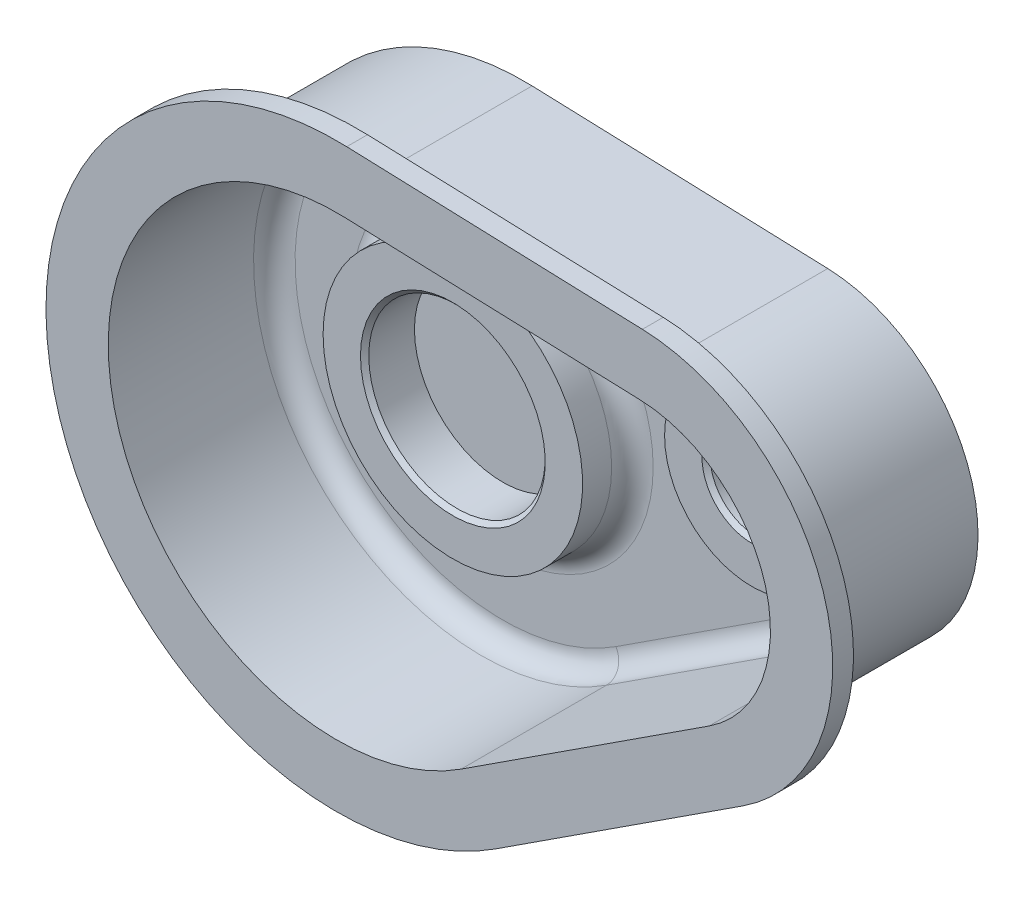
ISO-10303-21;
HEADER;
FILE_DESCRIPTION(('STEP AP214'),'2;1');
FILE_NAME('part.step','',(''),(''),'','','');
FILE_SCHEMA(('AUTOMOTIVE_DESIGN { 1 0 10303 214 1 1 1 1 }'));
ENDSEC;
DATA;
#1=APPLICATION_CONTEXT('core data for automotive mechanical design processes');
#2=APPLICATION_PROTOCOL_DEFINITION('international standard','automotive_design',2000,#1);
#3=PRODUCT_CONTEXT('',#1,'mechanical');
#4=PRODUCT('Part','Part','',(#3));
#5=PRODUCT_RELATED_PRODUCT_CATEGORY('part','',(#4));
#6=PRODUCT_DEFINITION_FORMATION('','',#4);
#7=PRODUCT_DEFINITION_CONTEXT('part definition',#1,'design');
#8=PRODUCT_DEFINITION('design','',#6,#7);
#9=PRODUCT_DEFINITION_SHAPE('','',#8);
#10=(LENGTH_UNIT() NAMED_UNIT(*) SI_UNIT(.MILLI.,.METRE.));
#11=(NAMED_UNIT(*) PLANE_ANGLE_UNIT() SI_UNIT($,.RADIAN.));
#12=(NAMED_UNIT(*) SI_UNIT($,.STERADIAN.) SOLID_ANGLE_UNIT());
#13=UNCERTAINTY_MEASURE_WITH_UNIT(LENGTH_MEASURE(1.E-05),#10,'distance_accuracy_value','');
#14=(GEOMETRIC_REPRESENTATION_CONTEXT(3) GLOBAL_UNCERTAINTY_ASSIGNED_CONTEXT((#13)) GLOBAL_UNIT_ASSIGNED_CONTEXT((#10,
#11,#12)) REPRESENTATION_CONTEXT('',''));
#15=CARTESIAN_POINT('',(0.,0.,0.));
#16=DIRECTION('',(0.,0.,1.));
#17=DIRECTION('',(1.,0.,0.));
#18=AXIS2_PLACEMENT_3D('',#15,#16,#17);
#19=CARTESIAN_POINT('',(0.,0.,45.));
#20=DIRECTION('',(0.,0.,1.));
#21=DIRECTION('',(1.,0.,0.));
#22=AXIS2_PLACEMENT_3D('',#19,#20,#21);
#23=PLANE('',#22);
#24=CARTESIAN_POINT('',(0.,0.,45.));
#25=DIRECTION('',(0.,0.,1.));
#26=DIRECTION('',(1.,0.,0.));
#27=AXIS2_PLACEMENT_3D('',#24,#25,#26);
#28=CIRCLE('',#27,55.);
#29=CARTESIAN_POINT('',(1.9190246900668,54.9665111157596,45.));
#30=VERTEX_POINT('',#29);
#31=CARTESIAN_POINT('',(29.9935827597899,-46.1018979352437,45.));
#32=VERTEX_POINT('',#31);
#33=EDGE_CURVE('E201',#30,#32,#28,.T.);
#34=ORIENTED_EDGE('',*,*,#33,.F.);
#35=DIRECTION('',(-0.999391111195628,0.0348913580012145,0.));
#36=VECTOR('',#35,1.);
#37=CARTESIAN_POINT('',(1.9190246900668,54.9665111157596,45.));
#38=LINE('',#37,#36);
#39=CARTESIAN_POINT('',(73.1339691350395,52.4802111138579,45.));
#40=VERTEX_POINT('',#39);
#41=EDGE_CURVE('E218',#40,#30,#38,.T.);
#42=ORIENTED_EDGE('',*,*,#41,.F.);
#43=CARTESIAN_POINT('',(72.,20.,45.));
#44=DIRECTION('',(0.,0.,1.));
#45=DIRECTION('',(1.,0.,0.));
#46=AXIS2_PLACEMENT_3D('',#43,#44,#45);
#47=CIRCLE('',#46,32.5);
#48=CARTESIAN_POINT('',(89.723480721694,-7.24203059809859,45.));
#49=VERTEX_POINT('',#48);
#50=EDGE_CURVE('E221',#49,#40,#47,.T.);
#51=ORIENTED_EDGE('',*,*,#50,.F.);
#52=DIRECTION('',(0.838216326095341,0.545337868359817,0.));
#53=VECTOR('',#52,1.);
#54=CARTESIAN_POINT('',(89.723480721694,-7.24203059809858,45.));
#55=LINE('',#54,#53);
#56=EDGE_CURVE('E224',#32,#49,#55,.T.);
#57=ORIENTED_EDGE('',*,*,#56,.F.);
#58=EDGE_LOOP('',(#34,#42,#51,#57));
#59=FACE_BOUND('',#58,.T.);
#60=CARTESIAN_POINT('',(72.,20.,45.));
#61=DIRECTION('',(0.,0.,1.));
#62=DIRECTION('',(1.,0.,0.));
#63=AXIS2_PLACEMENT_3D('',#60,#61,#62);
#64=CIRCLE('',#63,47.5);
#65=CARTESIAN_POINT('',(97.9035487470913,-19.8152754895287,45.));
#66=VERTEX_POINT('',#65);
#67=CARTESIAN_POINT('',(73.6573395050577,67.4710777817923,45.));
#68=VERTEX_POINT('',#67);
#69=EDGE_CURVE('E173',#66,#68,#64,.T.);
#70=ORIENTED_EDGE('',*,*,#69,.T.);
#71=DIRECTION('',(-0.999391111195628,0.0348913580012143,0.));
#72=VECTOR('',#71,1.);
#73=CARTESIAN_POINT('',(73.6573395050577,67.4710777817923,45.));
#74=LINE('',#73,#72);
#75=CARTESIAN_POINT('',(2.44239506008501,69.9573777836939,45.));
#76=VERTEX_POINT('',#75);
#77=EDGE_CURVE('E176',#68,#76,#74,.T.);
#78=ORIENTED_EDGE('',*,*,#77,.T.);
#79=CARTESIAN_POINT('',(0.,0.,45.));
#80=DIRECTION('',(0.,0.,1.));
#81=DIRECTION('',(1.,0.,0.));
#82=AXIS2_PLACEMENT_3D('',#79,#80,#81);
#83=CIRCLE('',#82,70.);
#84=CARTESIAN_POINT('',(38.1736507851872,-58.6751428266739,45.));
#85=VERTEX_POINT('',#84);
#86=EDGE_CURVE('E200',#76,#85,#83,.T.);
#87=ORIENTED_EDGE('',*,*,#86,.T.);
#88=DIRECTION('',(0.838216326095341,0.545337868359817,0.));
#89=VECTOR('',#88,1.);
#90=CARTESIAN_POINT('',(38.1736507851872,-58.6751428266739,45.));
#91=LINE('',#90,#89);
#92=EDGE_CURVE('E184',#85,#66,#91,.T.);
#93=ORIENTED_EDGE('',*,*,#92,.T.);
#94=EDGE_LOOP('',(#70,#78,#87,#93));
#95=FACE_BOUND('',#94,.T.);
#96=ADVANCED_FACE('F43',(#59,#95),#23,.T.);
#97=CARTESIAN_POINT('',(0.,0.,45.));
#98=DIRECTION('',(0.,0.,-1.));
#99=DIRECTION('',(-1.,0.,0.));
#100=AXIS2_PLACEMENT_3D('',#97,#98,#99);
#101=CYLINDRICAL_SURFACE('',#100,55.);
#102=DIRECTION('',(0.,0.,1.));
#103=VECTOR('',#102,1.);
#104=CARTESIAN_POINT('',(29.9935827597899,-46.1018979352437,45.));
#105=LINE('',#104,#103);
#106=CARTESIAN_POINT('',(29.9935827597899,-46.1018979352437,10.));
#107=VERTEX_POINT('',#106);
#108=EDGE_CURVE('E208',#32,#107,#105,.F.);
#109=ORIENTED_EDGE('',*,*,#108,.T.);
#110=CARTESIAN_POINT('',(0.,0.,10.));
#111=DIRECTION('',(0.,0.,1.));
#112=DIRECTION('',(1.,0.,0.));
#113=AXIS2_PLACEMENT_3D('',#110,#111,#112);
#114=CIRCLE('',#113,55.);
#115=CARTESIAN_POINT('',(1.9190246900668,54.9665111157595,10.));
#116=VERTEX_POINT('',#115);
#117=EDGE_CURVE('E253',#107,#116,#114,.F.);
#118=ORIENTED_EDGE('',*,*,#117,.T.);
#119=DIRECTION('',(0.,0.,-1.));
#120=VECTOR('',#119,1.);
#121=CARTESIAN_POINT('',(1.9190246900668,54.9665111157595,45.));
#122=LINE('',#121,#120);
#123=EDGE_CURVE('E214',#30,#116,#122,.T.);
#124=ORIENTED_EDGE('',*,*,#123,.F.);
#125=ORIENTED_EDGE('',*,*,#33,.T.);
#126=EDGE_LOOP('',(#109,#118,#124,#125));
#127=FACE_BOUND('',#126,.T.);
#128=ADVANCED_FACE('F300',(#127),#101,.F.);
#129=CARTESIAN_POINT('',(89.723480721694,-7.24203059809858,45.));
#130=DIRECTION('',(-0.545337868359817,0.838216326095341,0.));
#131=DIRECTION('',(-0.838216326095341,-0.545337868359817,0.));
#132=AXIS2_PLACEMENT_3D('',#129,#130,#131);
#133=PLANE('',#132);
#134=DIRECTION('',(0.,0.,-1.));
#135=VECTOR('',#134,1.);
#136=CARTESIAN_POINT('',(89.7234807216941,-7.2420305980986,45.));
#137=LINE('',#136,#135);
#138=CARTESIAN_POINT('',(89.7234807216941,-7.2420305980986,10.));
#139=VERTEX_POINT('',#138);
#140=EDGE_CURVE('E213',#49,#139,#137,.T.);
#141=ORIENTED_EDGE('',*,*,#140,.T.);
#142=DIRECTION('',(0.838216326095341,0.545337868359817,0.));
#143=VECTOR('',#142,1.);
#144=CARTESIAN_POINT('',(29.9935827597899,-46.1018979352438,10.));
#145=LINE('',#144,#143);
#146=EDGE_CURVE('E263',#139,#107,#145,.F.);
#147=ORIENTED_EDGE('',*,*,#146,.T.);
#148=ORIENTED_EDGE('',*,*,#108,.F.);
#149=ORIENTED_EDGE('',*,*,#56,.T.);
#150=EDGE_LOOP('',(#141,#147,#148,#149));
#151=FACE_BOUND('',#150,.T.);
#152=ADVANCED_FACE('F304',(#151),#133,.T.);
#153=CARTESIAN_POINT('',(72.,20.,45.));
#154=DIRECTION('',(0.,0.,-1.));
#155=DIRECTION('',(-1.,0.,0.));
#156=AXIS2_PLACEMENT_3D('',#153,#154,#155);
#157=CYLINDRICAL_SURFACE('',#156,32.5);
#158=DIRECTION('',(0.,0.,1.));
#159=VECTOR('',#158,1.);
#160=CARTESIAN_POINT('',(73.1339691350395,52.4802111138579,45.));
#161=LINE('',#160,#159);
#162=CARTESIAN_POINT('',(73.1339691350395,52.4802111138579,10.));
#163=VERTEX_POINT('',#162);
#164=EDGE_CURVE('E220',#40,#163,#161,.F.);
#165=ORIENTED_EDGE('',*,*,#164,.T.);
#166=CARTESIAN_POINT('',(72.,20.,10.));
#167=DIRECTION('',(0.,0.,1.));
#168=DIRECTION('',(1.,0.,0.));
#169=AXIS2_PLACEMENT_3D('',#166,#167,#168);
#170=CIRCLE('',#169,32.5);
#171=EDGE_CURVE('E56',#163,#139,#170,.F.);
#172=ORIENTED_EDGE('',*,*,#171,.T.);
#173=ORIENTED_EDGE('',*,*,#140,.F.);
#174=ORIENTED_EDGE('',*,*,#50,.T.);
#175=EDGE_LOOP('',(#165,#172,#173,#174));
#176=FACE_BOUND('',#175,.T.);
#177=ADVANCED_FACE('F404',(#176),#157,.F.);
#178=CARTESIAN_POINT('',(1.9190246900668,54.9665111157596,45.));
#179=DIRECTION('',(-0.0348913580012145,-0.999391111195627,0.));
#180=DIRECTION('',(0.999391111195628,-0.0348913580012145,0.));
#181=AXIS2_PLACEMENT_3D('',#178,#179,#180);
#182=PLANE('',#181);
#183=ORIENTED_EDGE('',*,*,#123,.T.);
#184=DIRECTION('',(-0.999391111195628,0.0348913580012145,0.));
#185=VECTOR('',#184,1.);
#186=CARTESIAN_POINT('',(73.1339691350395,52.4802111138579,10.));
#187=LINE('',#186,#185);
#188=EDGE_CURVE('E70',#116,#163,#187,.F.);
#189=ORIENTED_EDGE('',*,*,#188,.T.);
#190=ORIENTED_EDGE('',*,*,#164,.F.);
#191=ORIENTED_EDGE('',*,*,#41,.T.);
#192=EDGE_LOOP('',(#183,#189,#190,#191));
#193=FACE_BOUND('',#192,.T.);
#194=ADVANCED_FACE('F397',(#193),#182,.T.);
#195=CARTESIAN_POINT('',(0.,0.,5.));
#196=DIRECTION('',(0.,0.,1.));
#197=DIRECTION('',(1.,0.,0.));
#198=AXIS2_PLACEMENT_3D('',#195,#196,#197);
#199=PLANE('',#198);
#200=CARTESIAN_POINT('',(0.,0.,5.));
#201=DIRECTION('',(0.,0.,1.));
#202=DIRECTION('',(1.,0.,0.));
#203=AXIS2_PLACEMENT_3D('',#200,#201,#202);
#204=CIRCLE('',#203,36.25);
#205=CARTESIAN_POINT('',(36.25,0.,5.));
#206=VERTEX_POINT('',#205);
#207=EDGE_CURVE('E255',#206,#206,#204,.F.);
#208=ORIENTED_EDGE('',*,*,#207,.T.);
#209=EDGE_LOOP('',(#208));
#210=FACE_BOUND('',#209,.T.);
#211=DIRECTION('',(-0.999391111195628,0.0348913580012145,0.));
#212=VECTOR('',#211,1.);
#213=CARTESIAN_POINT('',(1.74456790006073,49.9695555597814,5.));
#214=LINE('',#213,#212);
#215=CARTESIAN_POINT('',(72.9595123450334,47.4832555578798,5.));
#216=VERTEX_POINT('',#215);
#217=CARTESIAN_POINT('',(1.74456790006073,49.9695555597814,5.));
#218=VERTEX_POINT('',#217);
#219=EDGE_CURVE('E250',#216,#218,#214,.T.);
#220=ORIENTED_EDGE('',*,*,#219,.T.);
#221=CARTESIAN_POINT('',(0.,0.,5.));
#222=DIRECTION('',(0.,0.,1.));
#223=DIRECTION('',(1.,0.,0.));
#224=AXIS2_PLACEMENT_3D('',#221,#222,#223);
#225=CIRCLE('',#224,50.);
#226=CARTESIAN_POINT('',(27.2668934179909,-41.9108163047671,5.));
#227=VERTEX_POINT('',#226);
#228=EDGE_CURVE('E248',#218,#227,#225,.T.);
#229=ORIENTED_EDGE('',*,*,#228,.T.);
#230=DIRECTION('',(0.838216326095341,0.545337868359817,0.));
#231=VECTOR('',#230,1.);
#232=CARTESIAN_POINT('',(86.996791379895,-3.05094896762188,5.));
#233=LINE('',#232,#231);
#234=CARTESIAN_POINT('',(86.996791379895,-3.05094896762188,5.));
#235=VERTEX_POINT('',#234);
#236=EDGE_CURVE('E243',#227,#235,#233,.T.);
#237=ORIENTED_EDGE('',*,*,#236,.T.);
#238=CARTESIAN_POINT('',(72.,20.,5.));
#239=DIRECTION('',(0.,0.,1.));
#240=DIRECTION('',(1.,0.,0.));
#241=AXIS2_PLACEMENT_3D('',#238,#239,#240);
#242=CIRCLE('',#241,27.5);
#243=EDGE_CURVE('E244',#235,#216,#242,.T.);
#244=ORIENTED_EDGE('',*,*,#243,.T.);
#245=EDGE_LOOP('',(#220,#229,#237,#244));
#246=FACE_BOUND('',#245,.T.);
#247=CARTESIAN_POINT('',(72.,20.,5.));
#248=DIRECTION('',(0.,0.,1.));
#249=DIRECTION('',(1.,0.,0.));
#250=AXIS2_PLACEMENT_3D('',#247,#248,#249);
#251=CIRCLE('',#250,21.);
#252=CARTESIAN_POINT('',(93.,20.,5.));
#253=VERTEX_POINT('',#252);
#254=EDGE_CURVE('E239',#253,#253,#251,.T.);
#255=ORIENTED_EDGE('',*,*,#254,.F.);
#256=EDGE_LOOP('',(#255));
#257=FACE_BOUND('',#256,.T.);
#258=ADVANCED_FACE('F315',(#210,#246,#257),#199,.T.);
#259=CARTESIAN_POINT('',(72.,20.,40.));
#260=DIRECTION('',(0.,0.,1.));
#261=DIRECTION('',(1.,0.,0.));
#262=AXIS2_PLACEMENT_3D('',#259,#260,#261);
#263=CYLINDRICAL_SURFACE('',#262,47.5);
#264=ORIENTED_EDGE('',*,*,#69,.F.);
#265=DIRECTION('',(0.,0.,1.));
#266=VECTOR('',#265,1.);
#267=CARTESIAN_POINT('',(97.9035487470913,-19.8152754895287,40.));
#268=LINE('',#267,#266);
#269=CARTESIAN_POINT('',(97.9035487470913,-19.8152754895287,40.));
#270=VERTEX_POINT('',#269);
#271=EDGE_CURVE('E204',#270,#66,#268,.T.);
#272=ORIENTED_EDGE('',*,*,#271,.F.);
#273=CARTESIAN_POINT('',(72.,20.,40.));
#274=DIRECTION('',(0.,0.,1.));
#275=DIRECTION('',(1.,0.,0.));
#276=AXIS2_PLACEMENT_3D('',#273,#274,#275);
#277=CIRCLE('',#276,47.5);
#278=CARTESIAN_POINT('',(73.6573395050577,67.4710777817923,40.));
#279=VERTEX_POINT('',#278);
#280=EDGE_CURVE('E181',#270,#279,#277,.T.);
#281=ORIENTED_EDGE('',*,*,#280,.T.);
#282=DIRECTION('',(0.,0.,1.));
#283=VECTOR('',#282,1.);
#284=CARTESIAN_POINT('',(73.6573395050577,67.4710777817923,40.));
#285=LINE('',#284,#283);
#286=EDGE_CURVE('E192',#279,#68,#285,.T.);
#287=ORIENTED_EDGE('',*,*,#286,.T.);
#288=EDGE_LOOP('',(#264,#272,#281,#287));
#289=FACE_BOUND('',#288,.T.);
#290=ADVANCED_FACE('F391',(#289),#263,.T.);
#291=CARTESIAN_POINT('',(38.1736507851872,-58.6751428266739,40.));
#292=DIRECTION('',(0.545337868359817,-0.838216326095341,0.));
#293=DIRECTION('',(0.838216326095341,0.545337868359817,0.));
#294=AXIS2_PLACEMENT_3D('',#291,#292,#293);
#295=PLANE('',#294);
#296=ORIENTED_EDGE('',*,*,#92,.F.);
#297=DIRECTION('',(0.,0.,1.));
#298=VECTOR('',#297,1.);
#299=CARTESIAN_POINT('',(38.1736507851872,-58.6751428266739,40.));
#300=LINE('',#299,#298);
#301=CARTESIAN_POINT('',(38.1736507851872,-58.6751428266739,40.));
#302=VERTEX_POINT('',#301);
#303=EDGE_CURVE('E203',#302,#85,#300,.T.);
#304=ORIENTED_EDGE('',*,*,#303,.F.);
#305=DIRECTION('',(0.838216326095341,0.545337868359817,0.));
#306=VECTOR('',#305,1.);
#307=CARTESIAN_POINT('',(38.1736507851872,-58.6751428266739,40.));
#308=LINE('',#307,#306);
#309=EDGE_CURVE('E191',#302,#270,#308,.T.);
#310=ORIENTED_EDGE('',*,*,#309,.T.);
#311=ORIENTED_EDGE('',*,*,#271,.T.);
#312=EDGE_LOOP('',(#296,#304,#310,#311));
#313=FACE_BOUND('',#312,.T.);
#314=ADVANCED_FACE('F402',(#313),#295,.T.);
#315=CARTESIAN_POINT('',(0.,0.,40.));
#316=DIRECTION('',(0.,0.,1.));
#317=DIRECTION('',(1.,0.,0.));
#318=AXIS2_PLACEMENT_3D('',#315,#316,#317);
#319=CYLINDRICAL_SURFACE('',#318,70.);
#320=ORIENTED_EDGE('',*,*,#86,.F.);
#321=DIRECTION('',(0.,0.,1.));
#322=VECTOR('',#321,1.);
#323=CARTESIAN_POINT('',(2.44239506008501,69.9573777836939,40.));
#324=LINE('',#323,#322);
#325=CARTESIAN_POINT('',(2.44239506008501,69.9573777836939,40.));
#326=VERTEX_POINT('',#325);
#327=EDGE_CURVE('E210',#326,#76,#324,.T.);
#328=ORIENTED_EDGE('',*,*,#327,.F.);
#329=CARTESIAN_POINT('',(0.,0.,40.));
#330=DIRECTION('',(0.,0.,1.));
#331=DIRECTION('',(1.,0.,0.));
#332=AXIS2_PLACEMENT_3D('',#329,#330,#331);
#333=CIRCLE('',#332,70.);
#334=EDGE_CURVE('E189',#326,#302,#333,.T.);
#335=ORIENTED_EDGE('',*,*,#334,.T.);
#336=ORIENTED_EDGE('',*,*,#303,.T.);
#337=EDGE_LOOP('',(#320,#328,#335,#336));
#338=FACE_BOUND('',#337,.T.);
#339=ADVANCED_FACE('F426',(#338),#319,.T.);
#340=CARTESIAN_POINT('',(73.6573395050577,67.4710777817923,40.));
#341=DIRECTION('',(0.0348913580012143,0.999391111195628,0.));
#342=DIRECTION('',(-0.999391111195628,0.0348913580012143,0.));
#343=AXIS2_PLACEMENT_3D('',#340,#341,#342);
#344=PLANE('',#343);
#345=ORIENTED_EDGE('',*,*,#77,.F.);
#346=ORIENTED_EDGE('',*,*,#286,.F.);
#347=DIRECTION('',(-0.999391111195628,0.0348913580012143,0.));
#348=VECTOR('',#347,1.);
#349=CARTESIAN_POINT('',(73.6573395050577,67.4710777817923,40.));
#350=LINE('',#349,#348);
#351=EDGE_CURVE('E183',#279,#326,#350,.T.);
#352=ORIENTED_EDGE('',*,*,#351,.T.);
#353=ORIENTED_EDGE('',*,*,#327,.T.);
#354=EDGE_LOOP('',(#345,#346,#352,#353));
#355=FACE_BOUND('',#354,.T.);
#356=ADVANCED_FACE('F424',(#355),#344,.T.);
#357=CARTESIAN_POINT('',(72.,20.,40.));
#358=DIRECTION('',(0.,0.,1.));
#359=DIRECTION('',(1.,0.,0.));
#360=AXIS2_PLACEMENT_3D('',#357,#358,#359);
#361=PLANE('',#360);
#362=DIRECTION('',(-0.999391111195628,0.0348913580012143,0.));
#363=VECTOR('',#362,1.);
#364=CARTESIAN_POINT('',(73.3084259250455,57.4771666698361,40.));
#365=LINE('',#364,#363);
#366=CARTESIAN_POINT('',(73.3084259250455,57.4771666698361,40.));
#367=VERTEX_POINT('',#366);
#368=CARTESIAN_POINT('',(2.09348148007288,59.9634666717377,40.));
#369=VERTEX_POINT('',#368);
#370=EDGE_CURVE('E149',#367,#369,#365,.T.);
#371=ORIENTED_EDGE('',*,*,#370,.T.);
#372=CARTESIAN_POINT('',(0.,0.,40.));
#373=DIRECTION('',(0.,0.,1.));
#374=DIRECTION('',(1.,0.,0.));
#375=AXIS2_PLACEMENT_3D('',#372,#373,#374);
#376=CIRCLE('',#375,60.);
#377=CARTESIAN_POINT('',(32.720272101589,-50.2929795657205,40.));
#378=VERTEX_POINT('',#377);
#379=EDGE_CURVE('E163',#369,#378,#376,.T.);
#380=ORIENTED_EDGE('',*,*,#379,.T.);
#381=DIRECTION('',(0.838216326095341,0.545337868359817,0.));
#382=VECTOR('',#381,1.);
#383=CARTESIAN_POINT('',(32.720272101589,-50.2929795657205,40.));
#384=LINE('',#383,#382);
#385=CARTESIAN_POINT('',(92.4501700634931,-11.4331122285753,40.));
#386=VERTEX_POINT('',#385);
#387=EDGE_CURVE('E168',#378,#386,#384,.T.);
#388=ORIENTED_EDGE('',*,*,#387,.T.);
#389=CARTESIAN_POINT('',(72.,20.,40.));
#390=DIRECTION('',(0.,0.,1.));
#391=DIRECTION('',(1.,0.,0.));
#392=AXIS2_PLACEMENT_3D('',#389,#390,#391);
#393=CIRCLE('',#392,37.5);
#394=EDGE_CURVE('E175',#386,#367,#393,.T.);
#395=ORIENTED_EDGE('',*,*,#394,.T.);
#396=EDGE_LOOP('',(#371,#380,#388,#395));
#397=FACE_BOUND('',#396,.T.);
#398=ORIENTED_EDGE('',*,*,#280,.F.);
#399=ORIENTED_EDGE('',*,*,#309,.F.);
#400=ORIENTED_EDGE('',*,*,#334,.F.);
#401=ORIENTED_EDGE('',*,*,#351,.F.);
#402=EDGE_LOOP('',(#398,#399,#400,#401));
#403=FACE_BOUND('',#402,.T.);
#404=ADVANCED_FACE('F167',(#397,#403),#361,.F.);
#405=CARTESIAN_POINT('',(0.,0.,0.));
#406=DIRECTION('',(0.,0.,1.));
#407=DIRECTION('',(1.,0.,0.));
#408=AXIS2_PLACEMENT_3D('',#405,#406,#407);
#409=PLANE('',#408);
#410=CARTESIAN_POINT('',(0.,0.,0.));
#411=DIRECTION('',(0.,0.,1.));
#412=DIRECTION('',(1.,0.,0.));
#413=AXIS2_PLACEMENT_3D('',#410,#411,#412);
#414=CIRCLE('',#413,60.);
#415=CARTESIAN_POINT('',(2.09348148007288,59.9634666717377,0.));
#416=VERTEX_POINT('',#415);
#417=CARTESIAN_POINT('',(32.720272101589,-50.2929795657205,0.));
#418=VERTEX_POINT('',#417);
#419=EDGE_CURVE('E212',#416,#418,#414,.T.);
#420=ORIENTED_EDGE('',*,*,#419,.F.);
#421=DIRECTION('',(-0.999391111195628,0.0348913580012145,0.));
#422=VECTOR('',#421,1.);
#423=CARTESIAN_POINT('',(2.09348148007288,59.9634666717377,0.));
#424=LINE('',#423,#422);
#425=CARTESIAN_POINT('',(73.3084259250455,57.4771666698361,0.));
#426=VERTEX_POINT('',#425);
#427=EDGE_CURVE('E153',#426,#416,#424,.T.);
#428=ORIENTED_EDGE('',*,*,#427,.F.);
#429=CARTESIAN_POINT('',(72.,20.,0.));
#430=DIRECTION('',(0.,0.,1.));
#431=DIRECTION('',(1.,0.,0.));
#432=AXIS2_PLACEMENT_3D('',#429,#430,#431);
#433=CIRCLE('',#432,37.5);
#434=CARTESIAN_POINT('',(92.4501700634931,-11.4331122285753,0.));
#435=VERTEX_POINT('',#434);
#436=EDGE_CURVE('E235',#435,#426,#433,.T.);
#437=ORIENTED_EDGE('',*,*,#436,.F.);
#438=DIRECTION('',(0.838216326095341,0.545337868359817,0.));
#439=VECTOR('',#438,1.);
#440=CARTESIAN_POINT('',(92.4501700634931,-11.4331122285753,0.));
#441=LINE('',#440,#439);
#442=EDGE_CURVE('E230',#418,#435,#441,.T.);
#443=ORIENTED_EDGE('',*,*,#442,.F.);
#444=EDGE_LOOP('',(#420,#428,#437,#443));
#445=FACE_BOUND('',#444,.T.);
#446=ADVANCED_FACE('F313',(#445),#409,.F.);
#447=CARTESIAN_POINT('',(2.09348148007288,59.9634666717377,45.));
#448=DIRECTION('',(-0.0348913580012145,-0.999391111195627,0.));
#449=DIRECTION('',(0.999391111195628,-0.0348913580012145,0.));
#450=AXIS2_PLACEMENT_3D('',#447,#448,#449);
#451=PLANE('',#450);
#452=ORIENTED_EDGE('',*,*,#370,.F.);
#453=DIRECTION('',(0.,0.,-1.));
#454=VECTOR('',#453,1.);
#455=CARTESIAN_POINT('',(73.3084259250455,57.4771666698361,45.));
#456=LINE('',#455,#454);
#457=EDGE_CURVE('E159',#367,#426,#456,.T.);
#458=ORIENTED_EDGE('',*,*,#457,.T.);
#459=ORIENTED_EDGE('',*,*,#427,.T.);
#460=DIRECTION('',(0.,0.,-1.));
#461=VECTOR('',#460,1.);
#462=CARTESIAN_POINT('',(2.09348148007288,59.9634666717377,45.));
#463=LINE('',#462,#461);
#464=EDGE_CURVE('E146',#369,#416,#463,.T.);
#465=ORIENTED_EDGE('',*,*,#464,.F.);
#466=EDGE_LOOP('',(#452,#458,#459,#465));
#467=FACE_BOUND('',#466,.T.);
#468=ADVANCED_FACE('F147',(#467),#451,.F.);
#469=CARTESIAN_POINT('',(72.,20.,45.));
#470=DIRECTION('',(0.,0.,-1.));
#471=DIRECTION('',(-1.,0.,0.));
#472=AXIS2_PLACEMENT_3D('',#469,#470,#471);
#473=CYLINDRICAL_SURFACE('',#472,37.5);
#474=ORIENTED_EDGE('',*,*,#394,.F.);
#475=DIRECTION('',(0.,0.,-1.));
#476=VECTOR('',#475,1.);
#477=CARTESIAN_POINT('',(92.4501700634931,-11.4331122285753,45.));
#478=LINE('',#477,#476);
#479=EDGE_CURVE('E240',#386,#435,#478,.T.);
#480=ORIENTED_EDGE('',*,*,#479,.T.);
#481=ORIENTED_EDGE('',*,*,#436,.T.);
#482=ORIENTED_EDGE('',*,*,#457,.F.);
#483=EDGE_LOOP('',(#474,#480,#481,#482));
#484=FACE_BOUND('',#483,.T.);
#485=ADVANCED_FACE('F316',(#484),#473,.T.);
#486=CARTESIAN_POINT('',(92.4501700634931,-11.4331122285753,45.));
#487=DIRECTION('',(-0.545337868359817,0.838216326095341,0.));
#488=DIRECTION('',(-0.838216326095341,-0.545337868359817,0.));
#489=AXIS2_PLACEMENT_3D('',#486,#487,#488);
#490=PLANE('',#489);
#491=ORIENTED_EDGE('',*,*,#387,.F.);
#492=DIRECTION('',(0.,0.,-1.));
#493=VECTOR('',#492,1.);
#494=CARTESIAN_POINT('',(32.720272101589,-50.2929795657205,45.));
#495=LINE('',#494,#493);
#496=EDGE_CURVE('E161',#378,#418,#495,.T.);
#497=ORIENTED_EDGE('',*,*,#496,.T.);
#498=ORIENTED_EDGE('',*,*,#442,.T.);
#499=ORIENTED_EDGE('',*,*,#479,.F.);
#500=EDGE_LOOP('',(#491,#497,#498,#499));
#501=FACE_BOUND('',#500,.T.);
#502=ADVANCED_FACE('F325',(#501),#490,.F.);
#503=CARTESIAN_POINT('',(0.,0.,45.));
#504=DIRECTION('',(0.,0.,-1.));
#505=DIRECTION('',(-1.,0.,0.));
#506=AXIS2_PLACEMENT_3D('',#503,#504,#505);
#507=CYLINDRICAL_SURFACE('',#506,60.);
#508=ORIENTED_EDGE('',*,*,#379,.F.);
#509=ORIENTED_EDGE('',*,*,#464,.T.);
#510=ORIENTED_EDGE('',*,*,#419,.T.);
#511=ORIENTED_EDGE('',*,*,#496,.F.);
#512=EDGE_LOOP('',(#508,#509,#510,#511));
#513=FACE_BOUND('',#512,.T.);
#514=ADVANCED_FACE('F162',(#513),#507,.T.);
#515=CARTESIAN_POINT('',(72.,20.,17.));
#516=DIRECTION('',(0.,0.,-1.));
#517=DIRECTION('',(-1.,0.,0.));
#518=AXIS2_PLACEMENT_3D('',#515,#516,#517);
#519=CYLINDRICAL_SURFACE('',#518,21.);
#520=CARTESIAN_POINT('',(72.,20.,17.));
#521=DIRECTION('',(0.,0.,-1.));
#522=DIRECTION('',(-1.,0.,0.));
#523=AXIS2_PLACEMENT_3D('',#520,#521,#522);
#524=CIRCLE('',#523,21.);
#525=CARTESIAN_POINT('',(51.,20.,17.));
#526=VERTEX_POINT('',#525);
#527=EDGE_CURVE('E276',#526,#526,#524,.T.);
#528=ORIENTED_EDGE('',*,*,#527,.T.);
#529=EDGE_LOOP('',(#528));
#530=FACE_BOUND('',#529,.T.);
#531=ORIENTED_EDGE('',*,*,#254,.T.);
#532=EDGE_LOOP('',(#531));
#533=FACE_BOUND('',#532,.T.);
#534=ADVANCED_FACE('F329',(#530,#533),#519,.T.);
#535=CARTESIAN_POINT('',(72.,20.,17.));
#536=DIRECTION('',(0.,0.,-1.));
#537=DIRECTION('',(-1.,0.,0.));
#538=AXIS2_PLACEMENT_3D('',#535,#536,#537);
#539=PLANE('',#538);
#540=CARTESIAN_POINT('',(72.,20.,17.));
#541=DIRECTION('',(0.,0.,-1.));
#542=DIRECTION('',(-1.,0.,0.));
#543=AXIS2_PLACEMENT_3D('',#540,#541,#542);
#544=CIRCLE('',#543,12.);
#545=CARTESIAN_POINT('',(60.,20.,17.));
#546=VERTEX_POINT('',#545);
#547=EDGE_CURVE('E261',#546,#546,#544,.T.);
#548=ORIENTED_EDGE('',*,*,#547,.T.);
#549=EDGE_LOOP('',(#548));
#550=FACE_BOUND('',#549,.T.);
#551=ORIENTED_EDGE('',*,*,#527,.F.);
#552=EDGE_LOOP('',(#551));
#553=FACE_BOUND('',#552,.T.);
#554=ADVANCED_FACE('F412',(#550,#553),#539,.F.);
#555=CARTESIAN_POINT('',(72.,20.,17.));
#556=DIRECTION('',(0.,0.,-1.));
#557=DIRECTION('',(-1.,0.,0.));
#558=AXIS2_PLACEMENT_3D('',#555,#556,#557);
#559=CYLINDRICAL_SURFACE('',#558,11.);
#560=CARTESIAN_POINT('',(72.,20.,16.));
#561=DIRECTION('',(0.,0.,-1.));
#562=DIRECTION('',(-1.,0.,0.));
#563=AXIS2_PLACEMENT_3D('',#560,#561,#562);
#564=CIRCLE('',#563,11.);
#565=CARTESIAN_POINT('',(61.,20.,16.));
#566=VERTEX_POINT('',#565);
#567=EDGE_CURVE('E278',#566,#566,#564,.F.);
#568=ORIENTED_EDGE('',*,*,#567,.T.);
#569=EDGE_LOOP('',(#568));
#570=FACE_BOUND('',#569,.T.);
#571=CARTESIAN_POINT('',(72.,20.,5.));
#572=DIRECTION('',(0.,0.,-1.));
#573=DIRECTION('',(-1.,0.,0.));
#574=AXIS2_PLACEMENT_3D('',#571,#572,#573);
#575=CIRCLE('',#574,11.);
#576=CARTESIAN_POINT('',(61.,20.,5.));
#577=VERTEX_POINT('',#576);
#578=EDGE_CURVE('E371',#577,#577,#575,.T.);
#579=ORIENTED_EDGE('',*,*,#578,.T.);
#580=EDGE_LOOP('',(#579));
#581=FACE_BOUND('',#580,.T.);
#582=ADVANCED_FACE('F364',(#570,#581),#559,.F.);
#583=CARTESIAN_POINT('',(0.,0.,17.));
#584=DIRECTION('',(0.,0.,-1.));
#585=DIRECTION('',(-1.,0.,0.));
#586=AXIS2_PLACEMENT_3D('',#583,#584,#585);
#587=CYLINDRICAL_SURFACE('',#586,31.25);
#588=CARTESIAN_POINT('',(0.,0.,10.));
#589=DIRECTION('',(0.,0.,1.));
#590=DIRECTION('',(1.,0.,0.));
#591=AXIS2_PLACEMENT_3D('',#588,#589,#590);
#592=CIRCLE('',#591,31.25);
#593=CARTESIAN_POINT('',(31.25,0.,10.));
#594=VERTEX_POINT('',#593);
#595=EDGE_CURVE('E259',#594,#594,#592,.T.);
#596=ORIENTED_EDGE('',*,*,#595,.T.);
#597=EDGE_LOOP('',(#596));
#598=FACE_BOUND('',#597,.T.);
#599=CARTESIAN_POINT('',(0.,0.,17.));
#600=DIRECTION('',(0.,0.,-1.));
#601=DIRECTION('',(-1.,0.,0.));
#602=AXIS2_PLACEMENT_3D('',#599,#600,#601);
#603=CIRCLE('',#602,31.25);
#604=CARTESIAN_POINT('',(-31.25,0.,17.));
#605=VERTEX_POINT('',#604);
#606=EDGE_CURVE('E170',#605,#605,#603,.T.);
#607=ORIENTED_EDGE('',*,*,#606,.T.);
#608=EDGE_LOOP('',(#607));
#609=FACE_BOUND('',#608,.T.);
#610=ADVANCED_FACE('F363',(#598,#609),#587,.T.);
#611=CARTESIAN_POINT('',(0.,0.,17.));
#612=DIRECTION('',(0.,0.,-1.));
#613=DIRECTION('',(-1.,0.,0.));
#614=AXIS2_PLACEMENT_3D('',#611,#612,#613);
#615=PLANE('',#614);
#616=CARTESIAN_POINT('',(0.,0.,17.));
#617=DIRECTION('',(0.,0.,-1.));
#618=DIRECTION('',(-1.,0.,0.));
#619=AXIS2_PLACEMENT_3D('',#616,#617,#618);
#620=CIRCLE('',#619,22.2500000000001);
#621=CARTESIAN_POINT('',(-22.2500000000001,0.,17.));
#622=VERTEX_POINT('',#621);
#623=EDGE_CURVE('E55',#622,#622,#620,.T.);
#624=ORIENTED_EDGE('',*,*,#623,.T.);
#625=EDGE_LOOP('',(#624));
#626=FACE_BOUND('',#625,.T.);
#627=ORIENTED_EDGE('',*,*,#606,.F.);
#628=EDGE_LOOP('',(#627));
#629=FACE_BOUND('',#628,.T.);
#630=ADVANCED_FACE('F284',(#626,#629),#615,.F.);
#631=CARTESIAN_POINT('',(0.,0.,17.));
#632=DIRECTION('',(0.,0.,-1.));
#633=DIRECTION('',(-1.,0.,0.));
#634=AXIS2_PLACEMENT_3D('',#631,#632,#633);
#635=CYLINDRICAL_SURFACE('',#634,21.25);
#636=CARTESIAN_POINT('',(0.,0.,15.9999999999999));
#637=DIRECTION('',(0.,0.,-1.));
#638=DIRECTION('',(-1.,0.,0.));
#639=AXIS2_PLACEMENT_3D('',#636,#637,#638);
#640=CIRCLE('',#639,21.25);
#641=CARTESIAN_POINT('',(-21.25,0.,15.9999999999999));
#642=VERTEX_POINT('',#641);
#643=EDGE_CURVE('E11',#642,#642,#640,.F.);
#644=ORIENTED_EDGE('',*,*,#643,.T.);
#645=EDGE_LOOP('',(#644));
#646=FACE_BOUND('',#645,.T.);
#647=CARTESIAN_POINT('',(0.,0.,5.));
#648=DIRECTION('',(0.,0.,-1.));
#649=DIRECTION('',(-1.,0.,0.));
#650=AXIS2_PLACEMENT_3D('',#647,#648,#649);
#651=CIRCLE('',#650,21.25);
#652=CARTESIAN_POINT('',(-21.25,0.,5.));
#653=VERTEX_POINT('',#652);
#654=EDGE_CURVE('E368',#653,#653,#651,.T.);
#655=ORIENTED_EDGE('',*,*,#654,.T.);
#656=EDGE_LOOP('',(#655));
#657=FACE_BOUND('',#656,.T.);
#658=ADVANCED_FACE('F383',(#646,#657),#635,.F.);
#659=ORIENTED_EDGE('',*,*,#578,.F.);
#660=EDGE_LOOP('',(#659));
#661=FACE_BOUND('',#660,.T.);
#662=ADVANCED_FACE('F384',(#661),#199,.T.);
#663=ORIENTED_EDGE('',*,*,#654,.F.);
#664=EDGE_LOOP('',(#663));
#665=FACE_BOUND('',#664,.T.);
#666=ADVANCED_FACE('F344',(#665),#199,.T.);
#667=CARTESIAN_POINT('',(72.,20.,10.));
#668=DIRECTION('',(0.,0.,1.));
#669=DIRECTION('',(1.,0.,0.));
#670=AXIS2_PLACEMENT_3D('',#667,#668,#669);
#671=TOROIDAL_SURFACE('',#670,27.5,5.);
#672=CARTESIAN_POINT('',(86.996791379895,-3.05094896762189,10.));
#673=DIRECTION('',(0.838216326095341,0.545337868359816,0.));
#674=DIRECTION('',(-0.545337868359816,0.838216326095341,0.));
#675=AXIS2_PLACEMENT_3D('',#672,#673,#674);
#676=CIRCLE('',#675,5.);
#677=EDGE_CURVE('E268',#139,#235,#676,.T.);
#678=ORIENTED_EDGE('',*,*,#677,.F.);
#679=ORIENTED_EDGE('',*,*,#171,.F.);
#680=CARTESIAN_POINT('',(72.9595123450334,47.4832555578798,10.));
#681=DIRECTION('',(0.999391111195628,-0.0348913580012155,0.));
#682=DIRECTION('',(0.0348913580012155,0.999391111195628,0.));
#683=AXIS2_PLACEMENT_3D('',#680,#681,#682);
#684=CIRCLE('',#683,5.);
#685=EDGE_CURVE('E271',#216,#163,#684,.T.);
#686=ORIENTED_EDGE('',*,*,#685,.F.);
#687=ORIENTED_EDGE('',*,*,#243,.F.);
#688=EDGE_LOOP('',(#678,#679,#686,#687));
#689=FACE_BOUND('',#688,.T.);
#690=ADVANCED_FACE('F341',(#689),#671,.F.);
#691=CARTESIAN_POINT('',(1.74456790006073,49.9695555597814,10.));
#692=DIRECTION('',(0.999391111195628,-0.0348913580012145,0.));
#693=DIRECTION('',(0.0348913580012145,0.999391111195628,0.));
#694=AXIS2_PLACEMENT_3D('',#691,#692,#693);
#695=CYLINDRICAL_SURFACE('',#694,5.);
#696=ORIENTED_EDGE('',*,*,#685,.T.);
#697=ORIENTED_EDGE('',*,*,#188,.F.);
#698=CARTESIAN_POINT('',(1.74456790006073,49.9695555597814,10.));
#699=DIRECTION('',(0.999391111195627,-0.0348913580012145,0.));
#700=DIRECTION('',(0.0348913580012145,0.999391111195628,0.));
#701=AXIS2_PLACEMENT_3D('',#698,#699,#700);
#702=CIRCLE('',#701,5.);
#703=EDGE_CURVE('E270',#218,#116,#702,.T.);
#704=ORIENTED_EDGE('',*,*,#703,.F.);
#705=ORIENTED_EDGE('',*,*,#219,.F.);
#706=EDGE_LOOP('',(#696,#697,#704,#705));
#707=FACE_BOUND('',#706,.T.);
#708=ADVANCED_FACE('F340',(#707),#695,.F.);
#709=CARTESIAN_POINT('',(27.2668934179909,-41.9108163047671,10.));
#710=DIRECTION('',(-0.838216326095341,-0.545337868359817,0.));
#711=DIRECTION('',(0.545337868359817,-0.838216326095341,0.));
#712=AXIS2_PLACEMENT_3D('',#709,#710,#711);
#713=CYLINDRICAL_SURFACE('',#712,5.);
#714=ORIENTED_EDGE('',*,*,#677,.T.);
#715=ORIENTED_EDGE('',*,*,#236,.F.);
#716=CARTESIAN_POINT('',(27.2668934179909,-41.910816304767,10.));
#717=DIRECTION('',(0.838216326095341,0.545337868359817,0.));
#718=DIRECTION('',(-0.545337868359817,0.838216326095341,0.));
#719=AXIS2_PLACEMENT_3D('',#716,#717,#718);
#720=CIRCLE('',#719,5.);
#721=EDGE_CURVE('E267',#107,#227,#720,.T.);
#722=ORIENTED_EDGE('',*,*,#721,.F.);
#723=ORIENTED_EDGE('',*,*,#146,.F.);
#724=EDGE_LOOP('',(#714,#715,#722,#723));
#725=FACE_BOUND('',#724,.T.);
#726=ADVANCED_FACE('F335',(#725),#713,.F.);
#727=CARTESIAN_POINT('',(0.,0.,10.));
#728=DIRECTION('',(0.,0.,1.));
#729=DIRECTION('',(1.,0.,0.));
#730=AXIS2_PLACEMENT_3D('',#727,#728,#729);
#731=TOROIDAL_SURFACE('',#730,50.,5.);
#732=ORIENTED_EDGE('',*,*,#703,.T.);
#733=ORIENTED_EDGE('',*,*,#117,.F.);
#734=ORIENTED_EDGE('',*,*,#721,.T.);
#735=ORIENTED_EDGE('',*,*,#228,.F.);
#736=EDGE_LOOP('',(#732,#733,#734,#735));
#737=FACE_BOUND('',#736,.T.);
#738=ADVANCED_FACE('F326',(#737),#731,.F.);
#739=CARTESIAN_POINT('',(0.,0.,10.));
#740=DIRECTION('',(0.,0.,1.));
#741=DIRECTION('',(1.,0.,0.));
#742=AXIS2_PLACEMENT_3D('',#739,#740,#741);
#743=TOROIDAL_SURFACE('',#742,36.25,5.);
#744=ORIENTED_EDGE('',*,*,#207,.F.);
#745=EDGE_LOOP('',(#744));
#746=FACE_BOUND('',#745,.T.);
#747=ORIENTED_EDGE('',*,*,#595,.F.);
#748=EDGE_LOOP('',(#747));
#749=FACE_BOUND('',#748,.T.);
#750=ADVANCED_FACE('F291',(#746,#749),#743,.F.);
#751=CARTESIAN_POINT('',(72.,20.,17.));
#752=DIRECTION('',(0.,0.,1.));
#753=DIRECTION('',(1.,0.,0.));
#754=AXIS2_PLACEMENT_3D('',#751,#752,#753);
#755=CONICAL_SURFACE('',#754,12.,0.785398163397457);
#756=ORIENTED_EDGE('',*,*,#567,.F.);
#757=EDGE_LOOP('',(#756));
#758=FACE_BOUND('',#757,.T.);
#759=ORIENTED_EDGE('',*,*,#547,.F.);
#760=EDGE_LOOP('',(#759));
#761=FACE_BOUND('',#760,.T.);
#762=ADVANCED_FACE('F290',(#758,#761),#755,.F.);
#763=CARTESIAN_POINT('',(0.,0.,17.));
#764=DIRECTION('',(0.,0.,1.));
#765=DIRECTION('',(1.,0.,0.));
#766=AXIS2_PLACEMENT_3D('',#763,#764,#765);
#767=CONICAL_SURFACE('',#766,22.2500000000001,0.785398163397457);
#768=ORIENTED_EDGE('',*,*,#643,.F.);
#769=EDGE_LOOP('',(#768));
#770=FACE_BOUND('',#769,.T.);
#771=ORIENTED_EDGE('',*,*,#623,.F.);
#772=EDGE_LOOP('',(#771));
#773=FACE_BOUND('',#772,.T.);
#774=ADVANCED_FACE('F46',(#770,#773),#767,.F.);
#775=CLOSED_SHELL('',(#96,#128,#152,#177,#194,#258,#290,#314,#339,#356,#404,#446,#468,#485,#502,
#514,#534,#554,#582,#610,#630,#658,#662,#666,#690,#708,#726,#738,#750,#762,#774));
#776=MANIFOLD_SOLID_BREP('B2',#775);
#777=ADVANCED_BREP_SHAPE_REPRESENTATION('',(#18,#776),#14);
#778=SHAPE_DEFINITION_REPRESENTATION(#9,#777);
ENDSEC;
END-ISO-10303-21;
